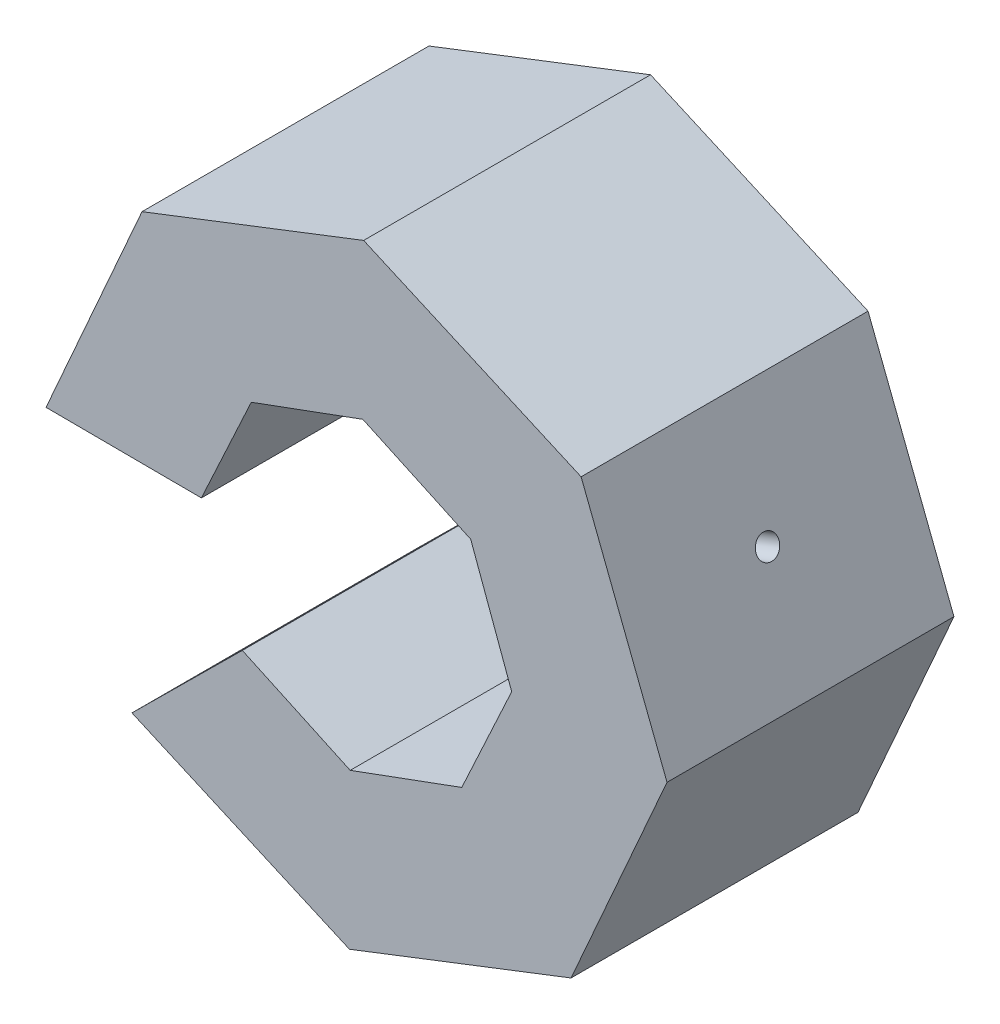
ISO-10303-21;
HEADER;
FILE_DESCRIPTION(('STEP AP214'),'2;1');
FILE_NAME('part.step','',(''),(''),'','','');
FILE_SCHEMA(('AUTOMOTIVE_DESIGN { 1 0 10303 214 1 1 1 1 }'));
ENDSEC;
DATA;
#1=APPLICATION_CONTEXT('core data for automotive mechanical design processes');
#2=APPLICATION_PROTOCOL_DEFINITION('international standard','automotive_design',2000,#1);
#3=PRODUCT_CONTEXT('',#1,'mechanical');
#4=PRODUCT('Part','Part','',(#3));
#5=PRODUCT_RELATED_PRODUCT_CATEGORY('part','',(#4));
#6=PRODUCT_DEFINITION_FORMATION('','',#4);
#7=PRODUCT_DEFINITION_CONTEXT('part definition',#1,'design');
#8=PRODUCT_DEFINITION('design','',#6,#7);
#9=PRODUCT_DEFINITION_SHAPE('','',#8);
#10=(LENGTH_UNIT() NAMED_UNIT(*) SI_UNIT(.MILLI.,.METRE.));
#11=(NAMED_UNIT(*) PLANE_ANGLE_UNIT() SI_UNIT($,.RADIAN.));
#12=(NAMED_UNIT(*) SI_UNIT($,.STERADIAN.) SOLID_ANGLE_UNIT());
#13=UNCERTAINTY_MEASURE_WITH_UNIT(LENGTH_MEASURE(1.E-05),#10,'distance_accuracy_value','');
#14=(GEOMETRIC_REPRESENTATION_CONTEXT(3) GLOBAL_UNCERTAINTY_ASSIGNED_CONTEXT((#13)) GLOBAL_UNIT_ASSIGNED_CONTEXT((#10,
#11,#12)) REPRESENTATION_CONTEXT('',''));
#15=CARTESIAN_POINT('',(0.,0.,0.));
#16=DIRECTION('',(0.,0.,1.));
#17=DIRECTION('',(1.,0.,0.));
#18=AXIS2_PLACEMENT_3D('',#15,#16,#17);
#19=CARTESIAN_POINT('',(-2.09995949118045,-4.53763926898139,-10.));
#20=DIRECTION('',(-0.419991898236083,-0.907527853796263,0.));
#21=DIRECTION('',(0.907527853796263,-0.419991898236083,0.));
#22=AXIS2_PLACEMENT_3D('',#19,#20,#21);
#23=PLANE('',#22);
#24=DIRECTION('',(0.907527853796263,-0.419991898236083,0.));
#25=VECTOR('',#24,1.);
#26=CARTESIAN_POINT('',(-2.09995949118045,-4.53763926898139,0.));
#27=LINE('',#26,#25);
#28=CARTESIAN_POINT('',(-3.97951121754928,-3.66780756730035,0.));
#29=VERTEX_POINT('',#28);
#30=CARTESIAN_POINT('',(-0.220407764811723,-5.40747097066239,0.));
#31=VERTEX_POINT('',#30);
#32=EDGE_CURVE('E182',#29,#31,#27,.T.);
#33=ORIENTED_EDGE('',*,*,#32,.T.);
#34=DIRECTION('',(0.,0.,1.));
#35=VECTOR('',#34,1.);
#36=CARTESIAN_POINT('',(-0.220407764811723,-5.40747097066239,-10.));
#37=LINE('',#36,#35);
#38=CARTESIAN_POINT('',(-0.220407764811723,-5.40747097066239,-10.));
#39=VERTEX_POINT('',#38);
#40=EDGE_CURVE('E11',#39,#31,#37,.T.);
#41=ORIENTED_EDGE('',*,*,#40,.F.);
#42=DIRECTION('',(0.907527853796263,-0.419991898236083,0.));
#43=VECTOR('',#42,1.);
#44=CARTESIAN_POINT('',(-2.09995949118045,-4.53763926898139,-10.));
#45=LINE('',#44,#43);
#46=CARTESIAN_POINT('',(-3.97951121754928,-3.66780756730035,-10.));
#47=VERTEX_POINT('',#46);
#48=EDGE_CURVE('E222',#47,#39,#45,.T.);
#49=ORIENTED_EDGE('',*,*,#48,.F.);
#50=DIRECTION('',(0.,0.,1.));
#51=VECTOR('',#50,1.);
#52=CARTESIAN_POINT('',(-3.97951121754928,-3.66780756730035,-10.));
#53=LINE('',#52,#51);
#54=EDGE_CURVE('E41',#47,#29,#53,.T.);
#55=ORIENTED_EDGE('',*,*,#54,.T.);
#56=EDGE_LOOP('',(#33,#41,#49,#55));
#57=FACE_BOUND('',#56,.T.);
#58=ADVANCED_FACE('F38',(#57),#23,.F.);
#59=CARTESIAN_POINT('',(1.72369990124434,-4.69349109410579,-10.));
#60=DIRECTION('',(0.344739980248867,-0.938698218821156,0.));
#61=DIRECTION('',(0.938698218821156,0.344739980248867,0.));
#62=AXIS2_PLACEMENT_3D('',#59,#60,#61);
#63=PLANE('',#62);
#64=DIRECTION('',(0.938698218821156,0.344739980248867,0.));
#65=VECTOR('',#64,1.);
#66=CARTESIAN_POINT('',(1.72369990124434,-4.69349109410579,0.));
#67=LINE('',#66,#65);
#68=CARTESIAN_POINT('',(3.66780756730029,-3.97951121754922,0.));
#69=VERTEX_POINT('',#68);
#70=EDGE_CURVE('E105',#31,#69,#67,.T.);
#71=ORIENTED_EDGE('',*,*,#70,.T.);
#72=DIRECTION('',(0.,0.,1.));
#73=VECTOR('',#72,1.);
#74=CARTESIAN_POINT('',(3.66780756730029,-3.97951121754922,-10.));
#75=LINE('',#74,#73);
#76=CARTESIAN_POINT('',(3.66780756730029,-3.97951121754922,-10.));
#77=VERTEX_POINT('',#76);
#78=EDGE_CURVE('E47',#77,#69,#75,.T.);
#79=ORIENTED_EDGE('',*,*,#78,.F.);
#80=DIRECTION('',(0.938698218821156,0.344739980248867,0.));
#81=VECTOR('',#80,1.);
#82=CARTESIAN_POINT('',(1.72369990124434,-4.69349109410579,-10.));
#83=LINE('',#82,#81);
#84=EDGE_CURVE('E55',#39,#77,#83,.T.);
#85=ORIENTED_EDGE('',*,*,#84,.F.);
#86=ORIENTED_EDGE('',*,*,#40,.T.);
#87=EDGE_LOOP('',(#71,#79,#85,#86));
#88=FACE_BOUND('',#87,.T.);
#89=ADVANCED_FACE('F266',(#88),#63,.F.);
#90=CARTESIAN_POINT('',(4.53763926898132,-2.09995949118042,-10.));
#91=DIRECTION('',(0.907527853796263,-0.419991898236083,0.));
#92=DIRECTION('',(0.419991898236083,0.907527853796263,0.));
#93=AXIS2_PLACEMENT_3D('',#90,#91,#92);
#94=PLANE('',#93);
#95=DIRECTION('',(0.419991898236083,0.907527853796263,0.));
#96=VECTOR('',#95,1.);
#97=CARTESIAN_POINT('',(4.53763926898132,-2.09995949118042,0.));
#98=LINE('',#97,#96);
#99=CARTESIAN_POINT('',(5.40747097066235,-0.220407764811626,0.));
#100=VERTEX_POINT('',#99);
#101=EDGE_CURVE('E167',#69,#100,#98,.T.);
#102=ORIENTED_EDGE('',*,*,#101,.T.);
#103=DIRECTION('',(0.,0.,1.));
#104=VECTOR('',#103,1.);
#105=CARTESIAN_POINT('',(5.40747097066235,-0.220407764811626,-10.));
#106=LINE('',#105,#104);
#107=CARTESIAN_POINT('',(5.40747097066235,-0.220407764811626,-10.));
#108=VERTEX_POINT('',#107);
#109=EDGE_CURVE('E165',#108,#100,#106,.T.);
#110=ORIENTED_EDGE('',*,*,#109,.F.);
#111=DIRECTION('',(0.419991898236083,0.907527853796263,0.));
#112=VECTOR('',#111,1.);
#113=CARTESIAN_POINT('',(4.53763926898132,-2.09995949118042,-10.));
#114=LINE('',#113,#112);
#115=EDGE_CURVE('E156',#77,#108,#114,.T.);
#116=ORIENTED_EDGE('',*,*,#115,.F.);
#117=ORIENTED_EDGE('',*,*,#78,.T.);
#118=EDGE_LOOP('',(#102,#110,#116,#117));
#119=FACE_BOUND('',#118,.T.);
#120=ADVANCED_FACE('F166',(#119),#94,.F.);
#121=CARTESIAN_POINT('',(4.69349109410578,1.72369990124433,-10.));
#122=DIRECTION('',(0.938698218821156,0.344739980248866,0.));
#123=DIRECTION('',(-0.344739980248866,0.938698218821156,0.));
#124=AXIS2_PLACEMENT_3D('',#121,#122,#123);
#125=PLANE('',#124);
#126=CARTESIAN_POINT('',(4.66273607708023,1.80744324798598,-5.00000000000001));
#127=DIRECTION('',(0.938698218821156,0.344739980248866,0.));
#128=DIRECTION('',(-0.344739980248866,0.938698218821156,0.));
#129=AXIS2_PLACEMENT_3D('',#126,#127,#128);
#130=ELLIPSE('',#129,0.400063665486948,0.4);
#131=CARTESIAN_POINT('',(4.52481813694197,2.18298229819365,-5.00000000000001));
#132=VERTEX_POINT('',#131);
#133=EDGE_CURVE('E186',#132,#132,#130,.T.);
#134=ORIENTED_EDGE('',*,*,#133,.T.);
#135=EDGE_LOOP('',(#134));
#136=FACE_BOUND('',#135,.T.);
#137=DIRECTION('',(-0.344739980248866,0.938698218821156,0.));
#138=VECTOR('',#137,1.);
#139=CARTESIAN_POINT('',(4.69349109410578,1.72369990124433,0.));
#140=LINE('',#139,#138);
#141=CARTESIAN_POINT('',(3.97951121754921,3.66780756730029,0.));
#142=VERTEX_POINT('',#141);
#143=EDGE_CURVE('E219',#100,#142,#140,.T.);
#144=ORIENTED_EDGE('',*,*,#143,.T.);
#145=DIRECTION('',(0.,0.,1.));
#146=VECTOR('',#145,1.);
#147=CARTESIAN_POINT('',(3.97951121754921,3.66780756730029,-10.));
#148=LINE('',#147,#146);
#149=CARTESIAN_POINT('',(3.97951121754921,3.66780756730029,-10.));
#150=VERTEX_POINT('',#149);
#151=EDGE_CURVE('E170',#150,#142,#148,.T.);
#152=ORIENTED_EDGE('',*,*,#151,.F.);
#153=DIRECTION('',(-0.344739980248866,0.938698218821156,0.));
#154=VECTOR('',#153,1.);
#155=CARTESIAN_POINT('',(4.69349109410578,1.72369990124433,-10.));
#156=LINE('',#155,#154);
#157=EDGE_CURVE('E160',#108,#150,#156,.T.);
#158=ORIENTED_EDGE('',*,*,#157,.F.);
#159=ORIENTED_EDGE('',*,*,#109,.T.);
#160=EDGE_LOOP('',(#144,#152,#158,#159));
#161=FACE_BOUND('',#160,.T.);
#162=ADVANCED_FACE('F172',(#136,#161),#125,.F.);
#163=CARTESIAN_POINT('',(2.09995949118042,4.53763926898132,-10.));
#164=DIRECTION('',(0.419991898236083,0.907527853796263,0.));
#165=DIRECTION('',(-0.907527853796263,0.419991898236083,0.));
#166=AXIS2_PLACEMENT_3D('',#163,#164,#165);
#167=PLANE('',#166);
#168=DIRECTION('',(-0.907527853796263,0.419991898236083,0.));
#169=VECTOR('',#168,1.);
#170=CARTESIAN_POINT('',(2.09995949118042,4.53763926898132,0.));
#171=LINE('',#170,#169);
#172=CARTESIAN_POINT('',(0.220407764811618,5.40747097066235,0.));
#173=VERTEX_POINT('',#172);
#174=EDGE_CURVE('E217',#142,#173,#171,.T.);
#175=ORIENTED_EDGE('',*,*,#174,.T.);
#176=DIRECTION('',(0.,0.,1.));
#177=VECTOR('',#176,1.);
#178=CARTESIAN_POINT('',(0.220407764811618,5.40747097066235,-10.));
#179=LINE('',#178,#177);
#180=CARTESIAN_POINT('',(0.220407764811618,5.40747097066235,-10.));
#181=VERTEX_POINT('',#180);
#182=EDGE_CURVE('E226',#181,#173,#179,.T.);
#183=ORIENTED_EDGE('',*,*,#182,.F.);
#184=DIRECTION('',(-0.907527853796263,0.419991898236083,0.));
#185=VECTOR('',#184,1.);
#186=CARTESIAN_POINT('',(2.09995949118042,4.53763926898132,-10.));
#187=LINE('',#186,#185);
#188=EDGE_CURVE('E175',#150,#181,#187,.T.);
#189=ORIENTED_EDGE('',*,*,#188,.F.);
#190=ORIENTED_EDGE('',*,*,#151,.T.);
#191=EDGE_LOOP('',(#175,#183,#189,#190));
#192=FACE_BOUND('',#191,.T.);
#193=ADVANCED_FACE('F279',(#192),#167,.F.);
#194=CARTESIAN_POINT('',(-1.72369990124426,4.69349109410586,-10.));
#195=DIRECTION('',(-0.344739980248849,0.938698218821163,0.));
#196=DIRECTION('',(-0.938698218821163,-0.344739980248849,0.));
#197=AXIS2_PLACEMENT_3D('',#194,#195,#196);
#198=PLANE('',#197);
#199=DIRECTION('',(-0.938698218821163,-0.344739980248849,0.));
#200=VECTOR('',#199,1.);
#201=CARTESIAN_POINT('',(-1.72369990124426,4.69349109410586,0.));
#202=LINE('',#201,#200);
#203=CARTESIAN_POINT('',(-3.66780756730035,3.97951121754928,0.));
#204=VERTEX_POINT('',#203);
#205=EDGE_CURVE('E215',#173,#204,#202,.T.);
#206=ORIENTED_EDGE('',*,*,#205,.T.);
#207=DIRECTION('',(0.,0.,1.));
#208=VECTOR('',#207,1.);
#209=CARTESIAN_POINT('',(-3.66780756730035,3.97951121754928,-10.));
#210=LINE('',#209,#208);
#211=CARTESIAN_POINT('',(-3.66780756730035,3.97951121754928,-10.));
#212=VERTEX_POINT('',#211);
#213=EDGE_CURVE('E229',#212,#204,#210,.T.);
#214=ORIENTED_EDGE('',*,*,#213,.F.);
#215=DIRECTION('',(-0.938698218821163,-0.344739980248849,0.));
#216=VECTOR('',#215,1.);
#217=CARTESIAN_POINT('',(-1.72369990124426,4.69349109410586,-10.));
#218=LINE('',#217,#216);
#219=EDGE_CURVE('E177',#181,#212,#218,.T.);
#220=ORIENTED_EDGE('',*,*,#219,.F.);
#221=ORIENTED_EDGE('',*,*,#182,.T.);
#222=EDGE_LOOP('',(#206,#214,#220,#221));
#223=FACE_BOUND('',#222,.T.);
#224=ADVANCED_FACE('F283',(#223),#198,.F.);
#225=CARTESIAN_POINT('',(-4.53763926898139,2.09995949118045,-10.));
#226=DIRECTION('',(-0.907527853796263,0.419991898236083,0.));
#227=DIRECTION('',(-0.419991898236083,-0.907527853796263,0.));
#228=AXIS2_PLACEMENT_3D('',#225,#226,#227);
#229=PLANE('',#228);
#230=DIRECTION('',(-0.419991898236083,-0.907527853796263,0.));
#231=VECTOR('',#230,1.);
#232=CARTESIAN_POINT('',(-4.53763926898139,2.09995949118045,0.));
#233=LINE('',#232,#231);
#234=CARTESIAN_POINT('',(-5.40747097066244,0.220407764811621,0.));
#235=VERTEX_POINT('',#234);
#236=EDGE_CURVE('E213',#204,#235,#233,.T.);
#237=ORIENTED_EDGE('',*,*,#236,.T.);
#238=DIRECTION('',(0.,0.,1.));
#239=VECTOR('',#238,1.);
#240=CARTESIAN_POINT('',(-5.40747097066244,0.220407764811621,-10.));
#241=LINE('',#240,#239);
#242=CARTESIAN_POINT('',(-5.40747097066244,0.220407764811621,-10.));
#243=VERTEX_POINT('',#242);
#244=EDGE_CURVE('E232',#243,#235,#241,.T.);
#245=ORIENTED_EDGE('',*,*,#244,.F.);
#246=DIRECTION('',(-0.419991898236083,-0.907527853796263,0.));
#247=VECTOR('',#246,1.);
#248=CARTESIAN_POINT('',(-4.53763926898139,2.09995949118045,-10.));
#249=LINE('',#248,#247);
#250=EDGE_CURVE('E351',#212,#243,#249,.T.);
#251=ORIENTED_EDGE('',*,*,#250,.F.);
#252=ORIENTED_EDGE('',*,*,#213,.T.);
#253=EDGE_LOOP('',(#237,#245,#251,#252));
#254=FACE_BOUND('',#253,.T.);
#255=ADVANCED_FACE('F287',(#254),#229,.F.);
#256=CARTESIAN_POINT('',(0.000977107402223561,0.193030575239068,-10.));
#257=DIRECTION('',(0.00506186588820317,0.9999871886748,0.));
#258=DIRECTION('',(-0.9999871886748,0.00506186588820317,0.));
#259=AXIS2_PLACEMENT_3D('',#256,#257,#258);
#260=PLANE('',#259);
#261=DIRECTION('',(-0.9999871886748,0.00506186588820317,0.));
#262=VECTOR('',#261,1.);
#263=CARTESIAN_POINT('',(0.000977107402223561,0.193030575239068,0.));
#264=LINE('',#263,#262);
#265=CARTESIAN_POINT('',(-10.8210848431418,0.247811103277708,0.));
#266=VERTEX_POINT('',#265);
#267=EDGE_CURVE('E210',#235,#266,#264,.T.);
#268=ORIENTED_EDGE('',*,*,#267,.T.);
#269=DIRECTION('',(0.,0.,1.));
#270=VECTOR('',#269,1.);
#271=CARTESIAN_POINT('',(-10.8210848431418,0.247811103277708,-10.));
#272=LINE('',#271,#270);
#273=CARTESIAN_POINT('',(-10.8210848431418,0.247811103277708,-10.));
#274=VERTEX_POINT('',#273);
#275=EDGE_CURVE('E235',#274,#266,#272,.T.);
#276=ORIENTED_EDGE('',*,*,#275,.F.);
#277=DIRECTION('',(-0.9999871886748,0.00506186588820317,0.));
#278=VECTOR('',#277,1.);
#279=CARTESIAN_POINT('',(0.000977107402223561,0.193030575239068,-10.));
#280=LINE('',#279,#278);
#281=EDGE_CURVE('E349',#243,#274,#280,.T.);
#282=ORIENTED_EDGE('',*,*,#281,.F.);
#283=ORIENTED_EDGE('',*,*,#244,.T.);
#284=EDGE_LOOP('',(#268,#276,#282,#283));
#285=FACE_BOUND('',#284,.T.);
#286=ADVANCED_FACE('F291',(#285),#260,.F.);
#287=CARTESIAN_POINT('',(-9.1487592019707,4.0373512436196,-10.));
#288=DIRECTION('',(-0.914875920197069,0.40373512436196,0.));
#289=DIRECTION('',(-0.40373512436196,-0.914875920197069,0.));
#290=AXIS2_PLACEMENT_3D('',#287,#288,#289);
#291=PLANE('',#290);
#292=DIRECTION('',(-0.40373512436196,-0.914875920197069,0.));
#293=VECTOR('',#292,1.);
#294=CARTESIAN_POINT('',(-9.1487592019707,4.0373512436196,0.));
#295=LINE('',#294,#293);
#296=CARTESIAN_POINT('',(-7.47643356079958,7.82689138396153,0.));
#297=VERTEX_POINT('',#296);
#298=EDGE_CURVE('E207',#297,#266,#295,.T.);
#299=ORIENTED_EDGE('',*,*,#298,.F.);
#300=DIRECTION('',(0.,0.,1.));
#301=VECTOR('',#300,1.);
#302=CARTESIAN_POINT('',(-7.47643356079958,7.82689138396153,-10.));
#303=LINE('',#302,#301);
#304=CARTESIAN_POINT('',(-7.47643356079958,7.82689138396153,-10.));
#305=VERTEX_POINT('',#304);
#306=EDGE_CURVE('E237',#305,#297,#303,.T.);
#307=ORIENTED_EDGE('',*,*,#306,.F.);
#308=DIRECTION('',(-0.40373512436196,-0.914875920197069,0.));
#309=VECTOR('',#308,1.);
#310=CARTESIAN_POINT('',(-9.1487592019707,4.0373512436196,-10.));
#311=LINE('',#310,#309);
#312=EDGE_CURVE('E346',#305,#274,#311,.T.);
#313=ORIENTED_EDGE('',*,*,#312,.T.);
#314=ORIENTED_EDGE('',*,*,#275,.T.);
#315=EDGE_LOOP('',(#299,#307,#313,#314));
#316=FACE_BOUND('',#315,.T.);
#317=ADVANCED_FACE('F295',(#316),#291,.T.);
#318=CARTESIAN_POINT('',(-3.61431122876092,9.32398811355168,-10.));
#319=DIRECTION('',(-0.361431122876092,0.932398811355167,0.));
#320=DIRECTION('',(-0.932398811355167,-0.361431122876092,0.));
#321=AXIS2_PLACEMENT_3D('',#318,#319,#320);
#322=PLANE('',#321);
#323=DIRECTION('',(-0.932398811355167,-0.361431122876092,0.));
#324=VECTOR('',#323,1.);
#325=CARTESIAN_POINT('',(-3.61431122876092,9.32398811355168,0.));
#326=LINE('',#325,#324);
#327=CARTESIAN_POINT('',(0.247811103277686,10.8210848431418,0.));
#328=VERTEX_POINT('',#327);
#329=EDGE_CURVE('E204',#328,#297,#326,.T.);
#330=ORIENTED_EDGE('',*,*,#329,.F.);
#331=DIRECTION('',(0.,0.,1.));
#332=VECTOR('',#331,1.);
#333=CARTESIAN_POINT('',(0.247811103277686,10.8210848431418,-10.));
#334=LINE('',#333,#332);
#335=CARTESIAN_POINT('',(0.247811103277686,10.8210848431418,-10.));
#336=VERTEX_POINT('',#335);
#337=EDGE_CURVE('E239',#336,#328,#334,.T.);
#338=ORIENTED_EDGE('',*,*,#337,.F.);
#339=DIRECTION('',(-0.932398811355167,-0.361431122876092,0.));
#340=VECTOR('',#339,1.);
#341=CARTESIAN_POINT('',(-3.61431122876092,9.32398811355168,-10.));
#342=LINE('',#341,#340);
#343=EDGE_CURVE('E343',#336,#305,#342,.T.);
#344=ORIENTED_EDGE('',*,*,#343,.T.);
#345=ORIENTED_EDGE('',*,*,#306,.T.);
#346=EDGE_LOOP('',(#330,#338,#344,#345));
#347=FACE_BOUND('',#346,.T.);
#348=ADVANCED_FACE('F299',(#347),#322,.T.);
#349=CARTESIAN_POINT('',(4.0373512436196,9.14875920197069,-10.));
#350=DIRECTION('',(0.40373512436196,0.914875920197069,0.));
#351=DIRECTION('',(-0.914875920197069,0.40373512436196,0.));
#352=AXIS2_PLACEMENT_3D('',#349,#350,#351);
#353=PLANE('',#352);
#354=DIRECTION('',(-0.914875920197069,0.40373512436196,0.));
#355=VECTOR('',#354,1.);
#356=CARTESIAN_POINT('',(4.0373512436196,9.14875920197069,0.));
#357=LINE('',#356,#355);
#358=CARTESIAN_POINT('',(7.82689138396152,7.47643356079957,0.));
#359=VERTEX_POINT('',#358);
#360=EDGE_CURVE('E201',#359,#328,#357,.T.);
#361=ORIENTED_EDGE('',*,*,#360,.F.);
#362=DIRECTION('',(0.,0.,1.));
#363=VECTOR('',#362,1.);
#364=CARTESIAN_POINT('',(7.82689138396152,7.47643356079957,-10.));
#365=LINE('',#364,#363);
#366=CARTESIAN_POINT('',(7.82689138396152,7.47643356079957,-10.));
#367=VERTEX_POINT('',#366);
#368=EDGE_CURVE('E241',#367,#359,#365,.T.);
#369=ORIENTED_EDGE('',*,*,#368,.F.);
#370=DIRECTION('',(-0.914875920197069,0.40373512436196,0.));
#371=VECTOR('',#370,1.);
#372=CARTESIAN_POINT('',(4.0373512436196,9.14875920197069,-10.));
#373=LINE('',#372,#371);
#374=EDGE_CURVE('E340',#367,#336,#373,.T.);
#375=ORIENTED_EDGE('',*,*,#374,.T.);
#376=ORIENTED_EDGE('',*,*,#337,.T.);
#377=EDGE_LOOP('',(#361,#369,#375,#376));
#378=FACE_BOUND('',#377,.T.);
#379=ADVANCED_FACE('F303',(#378),#353,.T.);
#380=CARTESIAN_POINT('',(9.32398811355166,3.61431122876094,-10.));
#381=DIRECTION('',(0.932398811355166,0.361431122876094,0.));
#382=DIRECTION('',(-0.361431122876094,0.932398811355166,0.));
#383=AXIS2_PLACEMENT_3D('',#380,#381,#382);
#384=PLANE('',#383);
#385=CARTESIAN_POINT('',(9.32398811355166,3.61431122876096,-5.00000000000001));
#386=DIRECTION('',(0.932398811355166,0.361431122876093,0.));
#387=DIRECTION('',(-0.361431122876093,0.932398811355166,0.));
#388=AXIS2_PLACEMENT_3D('',#385,#386,#387);
#389=CIRCLE('',#388,0.4);
#390=CARTESIAN_POINT('',(9.17941566440122,3.98727075330302,-5.00000000000001));
#391=VERTEX_POINT('',#390);
#392=EDGE_CURVE('E376',#391,#391,#389,.T.);
#393=ORIENTED_EDGE('',*,*,#392,.F.);
#394=EDGE_LOOP('',(#393));
#395=FACE_BOUND('',#394,.T.);
#396=DIRECTION('',(-0.361431122876094,0.932398811355166,0.));
#397=VECTOR('',#396,1.);
#398=CARTESIAN_POINT('',(9.32398811355166,3.61431122876094,0.));
#399=LINE('',#398,#397);
#400=CARTESIAN_POINT('',(10.8210848431418,-0.247811103277685,0.));
#401=VERTEX_POINT('',#400);
#402=EDGE_CURVE('E198',#401,#359,#399,.T.);
#403=ORIENTED_EDGE('',*,*,#402,.F.);
#404=DIRECTION('',(0.,0.,1.));
#405=VECTOR('',#404,1.);
#406=CARTESIAN_POINT('',(10.8210848431418,-0.247811103277685,-10.));
#407=LINE('',#406,#405);
#408=CARTESIAN_POINT('',(10.8210848431418,-0.247811103277685,-10.));
#409=VERTEX_POINT('',#408);
#410=EDGE_CURVE('E243',#409,#401,#407,.T.);
#411=ORIENTED_EDGE('',*,*,#410,.F.);
#412=DIRECTION('',(-0.361431122876094,0.932398811355166,0.));
#413=VECTOR('',#412,1.);
#414=CARTESIAN_POINT('',(9.32398811355166,3.61431122876094,-10.));
#415=LINE('',#414,#413);
#416=EDGE_CURVE('E337',#409,#367,#415,.T.);
#417=ORIENTED_EDGE('',*,*,#416,.T.);
#418=ORIENTED_EDGE('',*,*,#368,.T.);
#419=EDGE_LOOP('',(#403,#411,#417,#418));
#420=FACE_BOUND('',#419,.T.);
#421=ADVANCED_FACE('F307',(#395,#420),#384,.T.);
#422=CARTESIAN_POINT('',(9.14875920197069,-4.0373512436196,-10.));
#423=DIRECTION('',(0.914875920197069,-0.403735124361959,0.));
#424=DIRECTION('',(0.403735124361959,0.914875920197069,0.));
#425=AXIS2_PLACEMENT_3D('',#422,#423,#424);
#426=PLANE('',#425);
#427=DIRECTION('',(0.403735124361959,0.914875920197069,0.));
#428=VECTOR('',#427,1.);
#429=CARTESIAN_POINT('',(9.14875920197069,-4.0373512436196,0.));
#430=LINE('',#429,#428);
#431=CARTESIAN_POINT('',(7.47643356079957,-7.82689138396152,0.));
#432=VERTEX_POINT('',#431);
#433=EDGE_CURVE('E195',#432,#401,#430,.T.);
#434=ORIENTED_EDGE('',*,*,#433,.F.);
#435=DIRECTION('',(0.,0.,1.));
#436=VECTOR('',#435,1.);
#437=CARTESIAN_POINT('',(7.47643356079957,-7.82689138396152,-10.));
#438=LINE('',#437,#436);
#439=CARTESIAN_POINT('',(7.47643356079957,-7.82689138396152,-10.));
#440=VERTEX_POINT('',#439);
#441=EDGE_CURVE('E245',#440,#432,#438,.T.);
#442=ORIENTED_EDGE('',*,*,#441,.F.);
#443=DIRECTION('',(0.403735124361959,0.914875920197069,0.));
#444=VECTOR('',#443,1.);
#445=CARTESIAN_POINT('',(9.14875920197069,-4.0373512436196,-10.));
#446=LINE('',#445,#444);
#447=EDGE_CURVE('E330',#440,#409,#446,.T.);
#448=ORIENTED_EDGE('',*,*,#447,.T.);
#449=ORIENTED_EDGE('',*,*,#410,.T.);
#450=EDGE_LOOP('',(#434,#442,#448,#449));
#451=FACE_BOUND('',#450,.T.);
#452=ADVANCED_FACE('F311',(#451),#426,.T.);
#453=CARTESIAN_POINT('',(3.61431122876091,-9.32398811355166,-10.));
#454=DIRECTION('',(0.361431122876091,-0.932398811355167,0.));
#455=DIRECTION('',(0.932398811355167,0.361431122876091,0.));
#456=AXIS2_PLACEMENT_3D('',#453,#454,#455);
#457=PLANE('',#456);
#458=DIRECTION('',(0.932398811355167,0.361431122876091,0.));
#459=VECTOR('',#458,1.);
#460=CARTESIAN_POINT('',(3.61431122876091,-9.32398811355166,0.));
#461=LINE('',#460,#459);
#462=CARTESIAN_POINT('',(-0.247811103277692,-10.8210848431418,0.));
#463=VERTEX_POINT('',#462);
#464=EDGE_CURVE('E192',#463,#432,#461,.T.);
#465=ORIENTED_EDGE('',*,*,#464,.F.);
#466=DIRECTION('',(0.,0.,1.));
#467=VECTOR('',#466,1.);
#468=CARTESIAN_POINT('',(-0.247811103277692,-10.8210848431418,-10.));
#469=LINE('',#468,#467);
#470=CARTESIAN_POINT('',(-0.247811103277692,-10.8210848431418,-10.));
#471=VERTEX_POINT('',#470);
#472=EDGE_CURVE('E247',#471,#463,#469,.T.);
#473=ORIENTED_EDGE('',*,*,#472,.F.);
#474=DIRECTION('',(0.932398811355167,0.361431122876091,0.));
#475=VECTOR('',#474,1.);
#476=CARTESIAN_POINT('',(3.61431122876091,-9.32398811355166,-10.));
#477=LINE('',#476,#475);
#478=EDGE_CURVE('E327',#471,#440,#477,.T.);
#479=ORIENTED_EDGE('',*,*,#478,.T.);
#480=ORIENTED_EDGE('',*,*,#441,.T.);
#481=EDGE_LOOP('',(#465,#473,#479,#480));
#482=FACE_BOUND('',#481,.T.);
#483=ADVANCED_FACE('F262',(#482),#457,.T.);
#484=CARTESIAN_POINT('',(-4.03735124361958,-9.14875920197069,-10.));
#485=DIRECTION('',(-0.403735124361958,-0.914875920197069,0.));
#486=DIRECTION('',(0.914875920197069,-0.403735124361958,0.));
#487=AXIS2_PLACEMENT_3D('',#484,#485,#486);
#488=PLANE('',#487);
#489=DIRECTION('',(0.914875920197069,-0.403735124361958,0.));
#490=VECTOR('',#489,1.);
#491=CARTESIAN_POINT('',(-4.03735124361958,-9.14875920197069,0.));
#492=LINE('',#491,#490);
#493=CARTESIAN_POINT('',(-7.82689138396152,-7.47643356079956,0.));
#494=VERTEX_POINT('',#493);
#495=EDGE_CURVE('E189',#494,#463,#492,.T.);
#496=ORIENTED_EDGE('',*,*,#495,.F.);
#497=DIRECTION('',(0.,0.,1.));
#498=VECTOR('',#497,1.);
#499=CARTESIAN_POINT('',(-7.82689138396152,-7.47643356079956,-10.));
#500=LINE('',#499,#498);
#501=CARTESIAN_POINT('',(-7.82689138396152,-7.47643356079956,-10.));
#502=VERTEX_POINT('',#501);
#503=EDGE_CURVE('E248',#502,#494,#500,.T.);
#504=ORIENTED_EDGE('',*,*,#503,.F.);
#505=DIRECTION('',(0.914875920197069,-0.403735124361958,0.));
#506=VECTOR('',#505,1.);
#507=CARTESIAN_POINT('',(-4.03735124361958,-9.14875920197069,-10.));
#508=LINE('',#507,#506);
#509=EDGE_CURVE('E326',#502,#471,#508,.T.);
#510=ORIENTED_EDGE('',*,*,#509,.T.);
#511=ORIENTED_EDGE('',*,*,#472,.T.);
#512=EDGE_LOOP('',(#496,#504,#510,#511));
#513=FACE_BOUND('',#512,.T.);
#514=ADVANCED_FACE('F256',(#513),#488,.T.);
#515=CARTESIAN_POINT('',(-0.135802309457836,0.137184147997955,-10.));
#516=DIRECTION('',(-0.703518442516619,0.710677001906626,0.));
#517=DIRECTION('',(-0.710677001906626,-0.703518442516619,0.));
#518=AXIS2_PLACEMENT_3D('',#515,#516,#517);
#519=PLANE('',#518);
#520=DIRECTION('',(-0.710677001906626,-0.703518442516619,0.));
#521=VECTOR('',#520,1.);
#522=CARTESIAN_POINT('',(-0.135802309457836,0.137184147997955,0.));
#523=LINE('',#522,#521);
#524=EDGE_CURVE('E185',#29,#494,#523,.T.);
#525=ORIENTED_EDGE('',*,*,#524,.F.);
#526=ORIENTED_EDGE('',*,*,#54,.F.);
#527=DIRECTION('',(-0.710677001906626,-0.703518442516619,0.));
#528=VECTOR('',#527,1.);
#529=CARTESIAN_POINT('',(-0.135802309457836,0.137184147997955,-10.));
#530=LINE('',#529,#528);
#531=EDGE_CURVE('E328',#47,#502,#530,.T.);
#532=ORIENTED_EDGE('',*,*,#531,.T.);
#533=ORIENTED_EDGE('',*,*,#503,.T.);
#534=EDGE_LOOP('',(#525,#526,#532,#533));
#535=FACE_BOUND('',#534,.T.);
#536=ADVANCED_FACE('F254',(#535),#519,.T.);
#537=CARTESIAN_POINT('',(0.,0.,-10.));
#538=DIRECTION('',(0.,0.,1.));
#539=DIRECTION('',(1.,0.,0.));
#540=AXIS2_PLACEMENT_3D('',#537,#538,#539);
#541=PLANE('',#540);
#542=ORIENTED_EDGE('',*,*,#48,.T.);
#543=ORIENTED_EDGE('',*,*,#84,.T.);
#544=ORIENTED_EDGE('',*,*,#115,.T.);
#545=ORIENTED_EDGE('',*,*,#157,.T.);
#546=ORIENTED_EDGE('',*,*,#188,.T.);
#547=ORIENTED_EDGE('',*,*,#219,.T.);
#548=ORIENTED_EDGE('',*,*,#250,.T.);
#549=ORIENTED_EDGE('',*,*,#281,.T.);
#550=ORIENTED_EDGE('',*,*,#312,.F.);
#551=ORIENTED_EDGE('',*,*,#343,.F.);
#552=ORIENTED_EDGE('',*,*,#374,.F.);
#553=ORIENTED_EDGE('',*,*,#416,.F.);
#554=ORIENTED_EDGE('',*,*,#447,.F.);
#555=ORIENTED_EDGE('',*,*,#478,.F.);
#556=ORIENTED_EDGE('',*,*,#509,.F.);
#557=ORIENTED_EDGE('',*,*,#531,.F.);
#558=EDGE_LOOP('',(#542,#543,#544,#545,#546,#547,#548,#549,#550,#551,#552,#553,#554,#555,#556,#557));
#559=FACE_BOUND('',#558,.T.);
#560=ADVANCED_FACE('F158',(#559),#541,.F.);
#561=CARTESIAN_POINT('',(0.,0.,0.));
#562=DIRECTION('',(0.,0.,1.));
#563=DIRECTION('',(1.,0.,0.));
#564=AXIS2_PLACEMENT_3D('',#561,#562,#563);
#565=PLANE('',#564);
#566=ORIENTED_EDGE('',*,*,#32,.F.);
#567=ORIENTED_EDGE('',*,*,#524,.T.);
#568=ORIENTED_EDGE('',*,*,#495,.T.);
#569=ORIENTED_EDGE('',*,*,#464,.T.);
#570=ORIENTED_EDGE('',*,*,#433,.T.);
#571=ORIENTED_EDGE('',*,*,#402,.T.);
#572=ORIENTED_EDGE('',*,*,#360,.T.);
#573=ORIENTED_EDGE('',*,*,#329,.T.);
#574=ORIENTED_EDGE('',*,*,#298,.T.);
#575=ORIENTED_EDGE('',*,*,#267,.F.);
#576=ORIENTED_EDGE('',*,*,#236,.F.);
#577=ORIENTED_EDGE('',*,*,#205,.F.);
#578=ORIENTED_EDGE('',*,*,#174,.F.);
#579=ORIENTED_EDGE('',*,*,#143,.F.);
#580=ORIENTED_EDGE('',*,*,#101,.F.);
#581=ORIENTED_EDGE('',*,*,#70,.F.);
#582=EDGE_LOOP('',(#566,#567,#568,#569,#570,#571,#572,#573,#574,#575,#576,#577,#578,#579,#580,#581));
#583=FACE_BOUND('',#582,.T.);
#584=ADVANCED_FACE('F253',(#583),#565,.T.);
#585=CARTESIAN_POINT('',(-551.980096322259,-213.967224742647,-5.00000000000001));
#586=DIRECTION('',(0.932398811355166,0.361431122876093,0.));
#587=DIRECTION('',(-0.361431122876093,0.932398811355166,0.));
#588=AXIS2_PLACEMENT_3D('',#585,#586,#587);
#589=CYLINDRICAL_SURFACE('',#588,0.4);
#590=ORIENTED_EDGE('',*,*,#392,.T.);
#591=EDGE_LOOP('',(#590));
#592=FACE_BOUND('',#591,.T.);
#593=ORIENTED_EDGE('',*,*,#133,.F.);
#594=EDGE_LOOP('',(#593));
#595=FACE_BOUND('',#594,.T.);
#596=ADVANCED_FACE('F380',(#592,#595),#589,.F.);
#597=CLOSED_SHELL('',(#58,#89,#120,#162,#193,#224,#255,#286,#317,#348,#379,#421,#452,#483,#514,
#536,#560,#584,#596));
#598=MANIFOLD_SOLID_BREP('B2',#597);
#599=ADVANCED_BREP_SHAPE_REPRESENTATION('',(#18,#598),#14);
#600=SHAPE_DEFINITION_REPRESENTATION(#9,#599);
ENDSEC;
END-ISO-10303-21;
